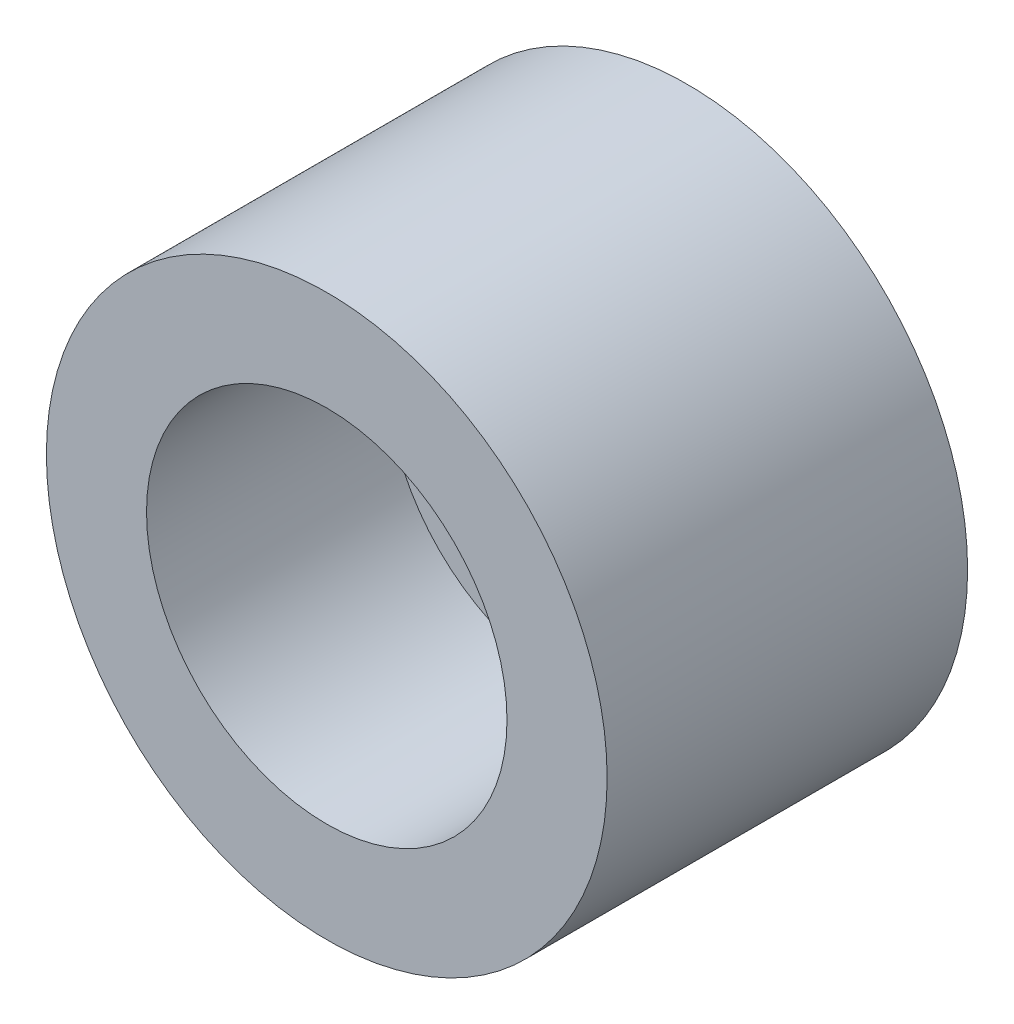
ISO-10303-21;
HEADER;
FILE_DESCRIPTION(('STEP AP214'),'2;1');
FILE_NAME('part.step','',(''),(''),'','','');
FILE_SCHEMA(('AUTOMOTIVE_DESIGN { 1 0 10303 214 1 1 1 1 }'));
ENDSEC;
DATA;
#1=APPLICATION_CONTEXT('core data for automotive mechanical design processes');
#2=APPLICATION_PROTOCOL_DEFINITION('international standard','automotive_design',2000,#1);
#3=PRODUCT_CONTEXT('',#1,'mechanical');
#4=PRODUCT('Part','Part','',(#3));
#5=PRODUCT_RELATED_PRODUCT_CATEGORY('part','',(#4));
#6=PRODUCT_DEFINITION_FORMATION('','',#4);
#7=PRODUCT_DEFINITION_CONTEXT('part definition',#1,'design');
#8=PRODUCT_DEFINITION('design','',#6,#7);
#9=PRODUCT_DEFINITION_SHAPE('','',#8);
#10=(LENGTH_UNIT() NAMED_UNIT(*) SI_UNIT(.MILLI.,.METRE.));
#11=(NAMED_UNIT(*) PLANE_ANGLE_UNIT() SI_UNIT($,.RADIAN.));
#12=(NAMED_UNIT(*) SI_UNIT($,.STERADIAN.) SOLID_ANGLE_UNIT());
#13=UNCERTAINTY_MEASURE_WITH_UNIT(LENGTH_MEASURE(1.E-05),#10,'distance_accuracy_value','');
#14=(GEOMETRIC_REPRESENTATION_CONTEXT(3) GLOBAL_UNCERTAINTY_ASSIGNED_CONTEXT((#13)) GLOBAL_UNIT_ASSIGNED_CONTEXT((#10,
#11,#12)) REPRESENTATION_CONTEXT('',''));
#15=CARTESIAN_POINT('',(0.,0.,0.));
#16=DIRECTION('',(0.,0.,1.));
#17=DIRECTION('',(1.,0.,0.));
#18=AXIS2_PLACEMENT_3D('',#15,#16,#17);
#19=CARTESIAN_POINT('',(0.,0.,4.5));
#20=DIRECTION('',(0.,0.,-1.));
#21=DIRECTION('',(-1.,0.,0.));
#22=AXIS2_PLACEMENT_3D('',#19,#20,#21);
#23=CYLINDRICAL_SURFACE('',#22,3.5);
#24=CARTESIAN_POINT('',(0.,0.,4.5));
#25=DIRECTION('',(0.,0.,1.));
#26=DIRECTION('',(1.,0.,0.));
#27=AXIS2_PLACEMENT_3D('',#24,#25,#26);
#28=CIRCLE('',#27,3.5);
#29=CARTESIAN_POINT('',(3.5,0.,4.5));
#30=VERTEX_POINT('',#29);
#31=EDGE_CURVE('E10',#30,#30,#28,.T.);
#32=ORIENTED_EDGE('',*,*,#31,.F.);
#33=EDGE_LOOP('',(#32));
#34=FACE_BOUND('',#33,.T.);
#35=CARTESIAN_POINT('',(0.,0.,0.));
#36=DIRECTION('',(0.,0.,1.));
#37=DIRECTION('',(1.,0.,0.));
#38=AXIS2_PLACEMENT_3D('',#35,#36,#37);
#39=CIRCLE('',#38,3.5);
#40=CARTESIAN_POINT('',(3.5,0.,0.));
#41=VERTEX_POINT('',#40);
#42=EDGE_CURVE('E48',#41,#41,#39,.T.);
#43=ORIENTED_EDGE('',*,*,#42,.T.);
#44=EDGE_LOOP('',(#43));
#45=FACE_BOUND('',#44,.T.);
#46=ADVANCED_FACE('F45',(#34,#45),#23,.T.);
#47=CARTESIAN_POINT('',(0.,0.,4.5));
#48=DIRECTION('',(0.,0.,1.));
#49=DIRECTION('',(1.,0.,0.));
#50=AXIS2_PLACEMENT_3D('',#47,#48,#49);
#51=PLANE('',#50);
#52=CARTESIAN_POINT('',(0.,0.,4.5));
#53=DIRECTION('',(0.,0.,1.));
#54=DIRECTION('',(1.,0.,0.));
#55=AXIS2_PLACEMENT_3D('',#52,#53,#54);
#56=CIRCLE('',#55,2.25);
#57=CARTESIAN_POINT('',(2.25,0.,4.5));
#58=VERTEX_POINT('',#57);
#59=EDGE_CURVE('E59',#58,#58,#56,.T.);
#60=ORIENTED_EDGE('',*,*,#59,.F.);
#61=EDGE_LOOP('',(#60));
#62=FACE_BOUND('',#61,.T.);
#63=ORIENTED_EDGE('',*,*,#31,.T.);
#64=EDGE_LOOP('',(#63));
#65=FACE_BOUND('',#64,.T.);
#66=ADVANCED_FACE('F76',(#62,#65),#51,.T.);
#67=CARTESIAN_POINT('',(0.,0.,0.));
#68=DIRECTION('',(0.,0.,1.));
#69=DIRECTION('',(1.,0.,0.));
#70=AXIS2_PLACEMENT_3D('',#67,#68,#69);
#71=PLANE('',#70);
#72=ORIENTED_EDGE('',*,*,#42,.F.);
#73=EDGE_LOOP('',(#72));
#74=FACE_BOUND('',#73,.T.);
#75=ADVANCED_FACE('F72',(#74),#71,.F.);
#76=CARTESIAN_POINT('',(0.,0.,1.5));
#77=DIRECTION('',(0.,0.,1.));
#78=DIRECTION('',(1.,0.,0.));
#79=AXIS2_PLACEMENT_3D('',#76,#77,#78);
#80=CYLINDRICAL_SURFACE('',#79,2.25);
#81=CARTESIAN_POINT('',(0.,0.,1.5));
#82=DIRECTION('',(0.,0.,1.));
#83=DIRECTION('',(1.,0.,0.));
#84=AXIS2_PLACEMENT_3D('',#81,#82,#83);
#85=CIRCLE('',#84,2.25);
#86=CARTESIAN_POINT('',(2.25,0.,1.5));
#87=VERTEX_POINT('',#86);
#88=EDGE_CURVE('E57',#87,#87,#85,.T.);
#89=ORIENTED_EDGE('',*,*,#88,.F.);
#90=EDGE_LOOP('',(#89));
#91=FACE_BOUND('',#90,.T.);
#92=ORIENTED_EDGE('',*,*,#59,.T.);
#93=EDGE_LOOP('',(#92));
#94=FACE_BOUND('',#93,.T.);
#95=ADVANCED_FACE('F69',(#91,#94),#80,.F.);
#96=CARTESIAN_POINT('',(0.,0.,1.5));
#97=DIRECTION('',(0.,0.,1.));
#98=DIRECTION('',(1.,0.,0.));
#99=AXIS2_PLACEMENT_3D('',#96,#97,#98);
#100=PLANE('',#99);
#101=ORIENTED_EDGE('',*,*,#88,.T.);
#102=EDGE_LOOP('',(#101));
#103=FACE_BOUND('',#102,.T.);
#104=ADVANCED_FACE('F67',(#103),#100,.T.);
#105=CLOSED_SHELL('',(#46,#66,#75,#95,#104));
#106=MANIFOLD_SOLID_BREP('B2',#105);
#107=ADVANCED_BREP_SHAPE_REPRESENTATION('',(#18,#106),#14);
#108=SHAPE_DEFINITION_REPRESENTATION(#9,#107);
ENDSEC;
END-ISO-10303-21;
